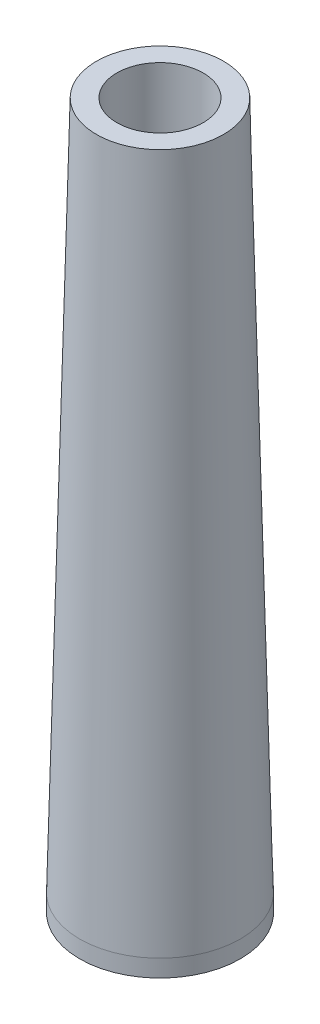
ISO-10303-21;
HEADER;
FILE_DESCRIPTION(('STEP AP214'),'2;1');
FILE_NAME('part.step','',(''),(''),'','','');
FILE_SCHEMA(('AUTOMOTIVE_DESIGN { 1 0 10303 214 1 1 1 1 }'));
ENDSEC;
DATA;
#1=APPLICATION_CONTEXT('core data for automotive mechanical design processes');
#2=APPLICATION_PROTOCOL_DEFINITION('international standard','automotive_design',2000,#1);
#3=PRODUCT_CONTEXT('',#1,'mechanical');
#4=PRODUCT('Part','Part','',(#3));
#5=PRODUCT_RELATED_PRODUCT_CATEGORY('part','',(#4));
#6=PRODUCT_DEFINITION_FORMATION('','',#4);
#7=PRODUCT_DEFINITION_CONTEXT('part definition',#1,'design');
#8=PRODUCT_DEFINITION('design','',#6,#7);
#9=PRODUCT_DEFINITION_SHAPE('','',#8);
#10=(LENGTH_UNIT() NAMED_UNIT(*) SI_UNIT(.MILLI.,.METRE.));
#11=(NAMED_UNIT(*) PLANE_ANGLE_UNIT() SI_UNIT($,.RADIAN.));
#12=(NAMED_UNIT(*) SI_UNIT($,.STERADIAN.) SOLID_ANGLE_UNIT());
#13=UNCERTAINTY_MEASURE_WITH_UNIT(LENGTH_MEASURE(1.E-05),#10,'distance_accuracy_value','');
#14=(GEOMETRIC_REPRESENTATION_CONTEXT(3) GLOBAL_UNCERTAINTY_ASSIGNED_CONTEXT((#13)) GLOBAL_UNIT_ASSIGNED_CONTEXT((#10,
#11,#12)) REPRESENTATION_CONTEXT('',''));
#15=CARTESIAN_POINT('',(0.,0.,0.));
#16=DIRECTION('',(0.,0.,1.));
#17=DIRECTION('',(1.,0.,0.));
#18=AXIS2_PLACEMENT_3D('',#15,#16,#17);
#19=CARTESIAN_POINT('',(0.,3.,0.));
#20=DIRECTION('',(0.,-1.,0.));
#21=DIRECTION('',(0.,0.,-1.));
#22=AXIS2_PLACEMENT_3D('',#19,#20,#21);
#23=CYLINDRICAL_SURFACE('',#22,14.);
#24=CARTESIAN_POINT('',(0.,3.,0.));
#25=DIRECTION('',(0.,1.,0.));
#26=DIRECTION('',(0.,0.,1.));
#27=AXIS2_PLACEMENT_3D('',#24,#25,#26);
#28=CIRCLE('',#27,14.);
#29=CARTESIAN_POINT('',(0.,3.,14.));
#30=VERTEX_POINT('',#29);
#31=EDGE_CURVE('E10',#30,#30,#28,.T.);
#32=ORIENTED_EDGE('',*,*,#31,.F.);
#33=EDGE_LOOP('',(#32));
#34=FACE_BOUND('',#33,.T.);
#35=CARTESIAN_POINT('',(0.,0.,0.));
#36=DIRECTION('',(0.,1.,0.));
#37=DIRECTION('',(0.,0.,1.));
#38=AXIS2_PLACEMENT_3D('',#35,#36,#37);
#39=CIRCLE('',#38,14.);
#40=CARTESIAN_POINT('',(0.,0.,14.));
#41=VERTEX_POINT('',#40);
#42=EDGE_CURVE('E46',#41,#41,#39,.T.);
#43=ORIENTED_EDGE('',*,*,#42,.T.);
#44=EDGE_LOOP('',(#43));
#45=FACE_BOUND('',#44,.T.);
#46=ADVANCED_FACE('F43',(#34,#45),#23,.T.);
#47=CARTESIAN_POINT('',(0.,0.,0.));
#48=DIRECTION('',(0.,1.,0.));
#49=DIRECTION('',(0.,0.,1.));
#50=AXIS2_PLACEMENT_3D('',#47,#48,#49);
#51=PLANE('',#50);
#52=CARTESIAN_POINT('',(0.,0.,0.));
#53=DIRECTION('',(0.,1.,0.));
#54=DIRECTION('',(0.,0.,1.));
#55=AXIS2_PLACEMENT_3D('',#52,#53,#54);
#56=CIRCLE('',#55,7.525);
#57=CARTESIAN_POINT('',(0.,0.,7.525));
#58=VERTEX_POINT('',#57);
#59=EDGE_CURVE('E55',#58,#58,#56,.T.);
#60=ORIENTED_EDGE('',*,*,#59,.T.);
#61=EDGE_LOOP('',(#60));
#62=FACE_BOUND('',#61,.T.);
#63=ORIENTED_EDGE('',*,*,#42,.F.);
#64=EDGE_LOOP('',(#63));
#65=FACE_BOUND('',#64,.T.);
#66=ADVANCED_FACE('F74',(#62,#65),#51,.F.);
#67=CARTESIAN_POINT('',(0.,123.,0.));
#68=DIRECTION('',(0.,1.,0.));
#69=DIRECTION('',(0.,0.,1.));
#70=AXIS2_PLACEMENT_3D('',#67,#68,#69);
#71=PLANE('',#70);
#72=CARTESIAN_POINT('',(0.,123.,0.));
#73=DIRECTION('',(0.,1.,0.));
#74=DIRECTION('',(0.,0.,1.));
#75=AXIS2_PLACEMENT_3D('',#72,#73,#74);
#76=CIRCLE('',#75,7.525);
#77=CARTESIAN_POINT('',(0.,123.,7.525));
#78=VERTEX_POINT('',#77);
#79=EDGE_CURVE('E57',#78,#78,#76,.T.);
#80=ORIENTED_EDGE('',*,*,#79,.F.);
#81=EDGE_LOOP('',(#80));
#82=FACE_BOUND('',#81,.T.);
#83=CARTESIAN_POINT('',(0.,123.,0.));
#84=DIRECTION('',(0.,-1.,0.));
#85=DIRECTION('',(0.,0.,-1.));
#86=AXIS2_PLACEMENT_3D('',#83,#84,#85);
#87=CIRCLE('',#86,11.075);
#88=CARTESIAN_POINT('',(0.,123.,-11.075));
#89=VERTEX_POINT('',#88);
#90=EDGE_CURVE('E61',#89,#89,#87,.T.);
#91=ORIENTED_EDGE('',*,*,#90,.F.);
#92=EDGE_LOOP('',(#91));
#93=FACE_BOUND('',#92,.T.);
#94=ADVANCED_FACE('F71',(#82,#93),#71,.T.);
#95=CARTESIAN_POINT('',(0.,0.,0.));
#96=DIRECTION('',(0.,1.,0.));
#97=DIRECTION('',(0.,0.,1.));
#98=AXIS2_PLACEMENT_3D('',#95,#96,#97);
#99=CYLINDRICAL_SURFACE('',#98,7.525);
#100=ORIENTED_EDGE('',*,*,#59,.F.);
#101=EDGE_LOOP('',(#100));
#102=FACE_BOUND('',#101,.T.);
#103=ORIENTED_EDGE('',*,*,#79,.T.);
#104=EDGE_LOOP('',(#103));
#105=FACE_BOUND('',#104,.T.);
#106=ADVANCED_FACE('F73',(#102,#105),#99,.F.);
#107=CARTESIAN_POINT('',(0.,3.,0.));
#108=DIRECTION('',(0.,-1.,0.));
#109=DIRECTION('',(0.,0.,-1.));
#110=AXIS2_PLACEMENT_3D('',#107,#108,#109);
#111=CONICAL_SURFACE('',#110,14.,0.0243701743275819);
#112=ORIENTED_EDGE('',*,*,#90,.T.);
#113=EDGE_LOOP('',(#112));
#114=FACE_BOUND('',#113,.T.);
#115=ORIENTED_EDGE('',*,*,#31,.T.);
#116=EDGE_LOOP('',(#115));
#117=FACE_BOUND('',#116,.T.);
#118=ADVANCED_FACE('F69',(#114,#117),#111,.T.);
#119=CLOSED_SHELL('',(#46,#66,#94,#106,#118));
#120=MANIFOLD_SOLID_BREP('B2',#119);
#121=ADVANCED_BREP_SHAPE_REPRESENTATION('',(#18,#120),#14);
#122=SHAPE_DEFINITION_REPRESENTATION(#9,#121);
ENDSEC;
END-ISO-10303-21;
